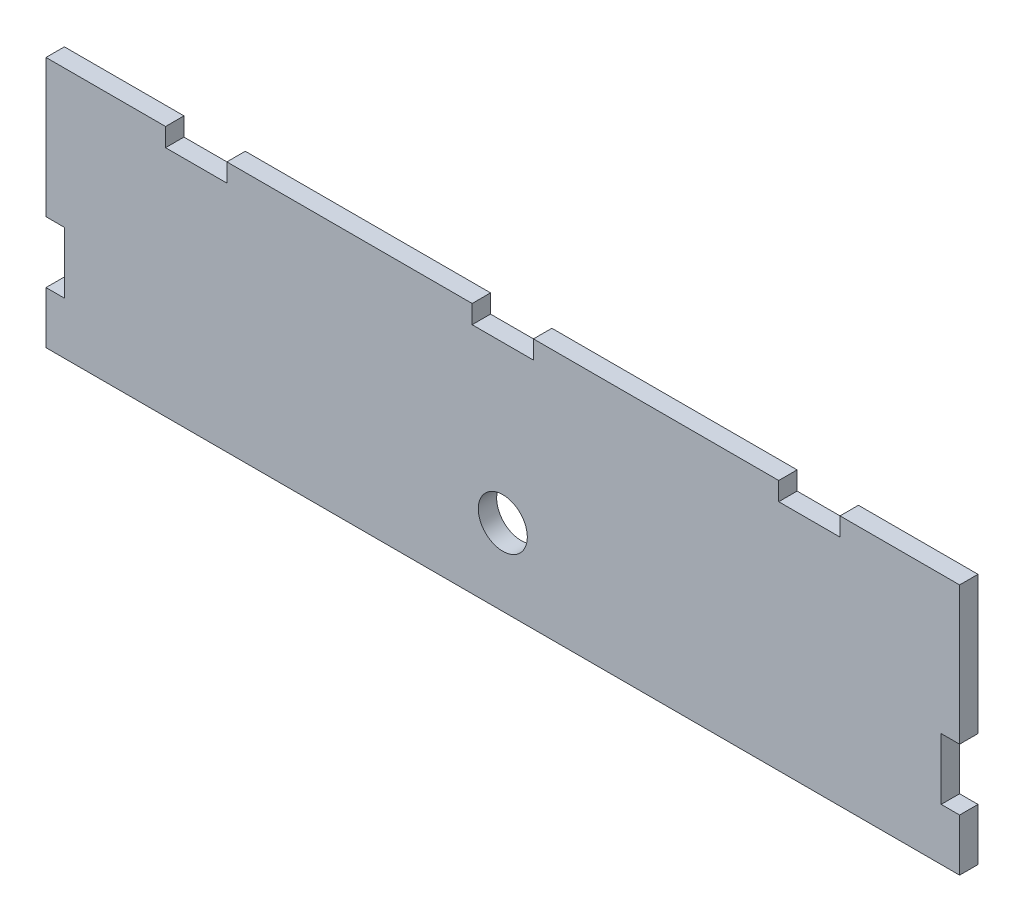
ISO-10303-21;
HEADER;
FILE_DESCRIPTION(('STEP AP214'),'2;1');
FILE_NAME('part.step','',(''),(''),'','','');
FILE_SCHEMA(('AUTOMOTIVE_DESIGN { 1 0 10303 214 1 1 1 1 }'));
ENDSEC;
DATA;
#1=APPLICATION_CONTEXT('core data for automotive mechanical design processes');
#2=APPLICATION_PROTOCOL_DEFINITION('international standard','automotive_design',2000,#1);
#3=PRODUCT_CONTEXT('',#1,'mechanical');
#4=PRODUCT('Part','Part','',(#3));
#5=PRODUCT_RELATED_PRODUCT_CATEGORY('part','',(#4));
#6=PRODUCT_DEFINITION_FORMATION('','',#4);
#7=PRODUCT_DEFINITION_CONTEXT('part definition',#1,'design');
#8=PRODUCT_DEFINITION('design','',#6,#7);
#9=PRODUCT_DEFINITION_SHAPE('','',#8);
#10=(LENGTH_UNIT() NAMED_UNIT(*) SI_UNIT(.MILLI.,.METRE.));
#11=(NAMED_UNIT(*) PLANE_ANGLE_UNIT() SI_UNIT($,.RADIAN.));
#12=(NAMED_UNIT(*) SI_UNIT($,.STERADIAN.) SOLID_ANGLE_UNIT());
#13=UNCERTAINTY_MEASURE_WITH_UNIT(LENGTH_MEASURE(1.E-05),#10,'distance_accuracy_value','');
#14=(GEOMETRIC_REPRESENTATION_CONTEXT(3) GLOBAL_UNCERTAINTY_ASSIGNED_CONTEXT((#13)) GLOBAL_UNIT_ASSIGNED_CONTEXT((#10,
#11,#12)) REPRESENTATION_CONTEXT('',''));
#15=CARTESIAN_POINT('',(0.,0.,0.));
#16=DIRECTION('',(0.,0.,1.));
#17=DIRECTION('',(1.,0.,0.));
#18=AXIS2_PLACEMENT_3D('',#15,#16,#17);
#19=CARTESIAN_POINT('',(74.5,-18.5,3.));
#20=DIRECTION('',(-1.,0.,0.));
#21=DIRECTION('',(0.,-1.,0.));
#22=AXIS2_PLACEMENT_3D('',#19,#20,#21);
#23=PLANE('',#22);
#24=DIRECTION('',(0.,1.,0.));
#25=VECTOR('',#24,1.);
#26=CARTESIAN_POINT('',(74.5,-18.5,0.));
#27=LINE('',#26,#25);
#28=CARTESIAN_POINT('',(74.5,-27.,0.));
#29=VERTEX_POINT('',#28);
#30=CARTESIAN_POINT('',(74.5,-18.5,0.));
#31=VERTEX_POINT('',#30);
#32=EDGE_CURVE('E224',#29,#31,#27,.T.);
#33=ORIENTED_EDGE('',*,*,#32,.T.);
#34=DIRECTION('',(0.,0.,-1.));
#35=VECTOR('',#34,1.);
#36=CARTESIAN_POINT('',(74.5,-18.5,3.));
#37=LINE('',#36,#35);
#38=CARTESIAN_POINT('',(74.5,-18.5,3.));
#39=VERTEX_POINT('',#38);
#40=EDGE_CURVE('E11',#39,#31,#37,.T.);
#41=ORIENTED_EDGE('',*,*,#40,.F.);
#42=DIRECTION('',(0.,1.,0.));
#43=VECTOR('',#42,1.);
#44=CARTESIAN_POINT('',(74.5,-18.5,3.));
#45=LINE('',#44,#43);
#46=CARTESIAN_POINT('',(74.5,-27.,3.));
#47=VERTEX_POINT('',#46);
#48=EDGE_CURVE('E271',#47,#39,#45,.T.);
#49=ORIENTED_EDGE('',*,*,#48,.F.);
#50=DIRECTION('',(0.,0.,-1.));
#51=VECTOR('',#50,1.);
#52=CARTESIAN_POINT('',(74.5,-27.,3.));
#53=LINE('',#52,#51);
#54=EDGE_CURVE('E220',#47,#29,#53,.T.);
#55=ORIENTED_EDGE('',*,*,#54,.T.);
#56=EDGE_LOOP('',(#33,#41,#49,#55));
#57=FACE_BOUND('',#56,.T.);
#58=ADVANCED_FACE('F32',(#57),#23,.F.);
#59=CARTESIAN_POINT('',(71.5,-18.5,3.));
#60=DIRECTION('',(0.,-1.,0.));
#61=DIRECTION('',(0.,0.,-1.));
#62=AXIS2_PLACEMENT_3D('',#59,#60,#61);
#63=PLANE('',#62);
#64=DIRECTION('',(-1.,0.,0.));
#65=VECTOR('',#64,1.);
#66=CARTESIAN_POINT('',(71.5,-18.5,0.));
#67=LINE('',#66,#65);
#68=CARTESIAN_POINT('',(71.5,-18.5,0.));
#69=VERTEX_POINT('',#68);
#70=EDGE_CURVE('E227',#31,#69,#67,.T.);
#71=ORIENTED_EDGE('',*,*,#70,.T.);
#72=DIRECTION('',(0.,0.,-1.));
#73=VECTOR('',#72,1.);
#74=CARTESIAN_POINT('',(71.5,-18.5,3.));
#75=LINE('',#74,#73);
#76=CARTESIAN_POINT('',(71.5,-18.5,3.));
#77=VERTEX_POINT('',#76);
#78=EDGE_CURVE('E40',#77,#69,#75,.T.);
#79=ORIENTED_EDGE('',*,*,#78,.F.);
#80=DIRECTION('',(-1.,0.,0.));
#81=VECTOR('',#80,1.);
#82=CARTESIAN_POINT('',(71.5,-18.5,3.));
#83=LINE('',#82,#81);
#84=EDGE_CURVE('E139',#39,#77,#83,.T.);
#85=ORIENTED_EDGE('',*,*,#84,.F.);
#86=ORIENTED_EDGE('',*,*,#40,.T.);
#87=EDGE_LOOP('',(#71,#79,#85,#86));
#88=FACE_BOUND('',#87,.T.);
#89=ADVANCED_FACE('F411',(#88),#63,.F.);
#90=CARTESIAN_POINT('',(71.5,-8.50000000000001,3.));
#91=DIRECTION('',(-1.,0.,0.));
#92=DIRECTION('',(0.,0.,1.));
#93=AXIS2_PLACEMENT_3D('',#90,#91,#92);
#94=PLANE('',#93);
#95=DIRECTION('',(0.,1.,0.));
#96=VECTOR('',#95,1.);
#97=CARTESIAN_POINT('',(71.5,-8.50000000000001,0.));
#98=LINE('',#97,#96);
#99=CARTESIAN_POINT('',(71.5,-8.50000000000001,0.));
#100=VERTEX_POINT('',#99);
#101=EDGE_CURVE('E230',#69,#100,#98,.T.);
#102=ORIENTED_EDGE('',*,*,#101,.T.);
#103=DIRECTION('',(0.,0.,-1.));
#104=VECTOR('',#103,1.);
#105=CARTESIAN_POINT('',(71.5,-8.50000000000001,3.));
#106=LINE('',#105,#104);
#107=CARTESIAN_POINT('',(71.5,-8.50000000000001,3.));
#108=VERTEX_POINT('',#107);
#109=EDGE_CURVE('E326',#108,#100,#106,.T.);
#110=ORIENTED_EDGE('',*,*,#109,.F.);
#111=DIRECTION('',(0.,1.,0.));
#112=VECTOR('',#111,1.);
#113=CARTESIAN_POINT('',(71.5,-8.50000000000001,3.));
#114=LINE('',#113,#112);
#115=EDGE_CURVE('E334',#77,#108,#114,.T.);
#116=ORIENTED_EDGE('',*,*,#115,.F.);
#117=ORIENTED_EDGE('',*,*,#78,.T.);
#118=EDGE_LOOP('',(#102,#110,#116,#117));
#119=FACE_BOUND('',#118,.T.);
#120=ADVANCED_FACE('F332',(#119),#94,.F.);
#121=CARTESIAN_POINT('',(71.5,-8.50000000000001,3.));
#122=DIRECTION('',(0.,1.,0.));
#123=DIRECTION('',(0.,0.,1.));
#124=AXIS2_PLACEMENT_3D('',#121,#122,#123);
#125=PLANE('',#124);
#126=DIRECTION('',(1.,0.,0.));
#127=VECTOR('',#126,1.);
#128=CARTESIAN_POINT('',(71.5,-8.50000000000001,0.));
#129=LINE('',#128,#127);
#130=CARTESIAN_POINT('',(74.5,-8.50000000000001,0.));
#131=VERTEX_POINT('',#130);
#132=EDGE_CURVE('E232',#100,#131,#129,.T.);
#133=ORIENTED_EDGE('',*,*,#132,.T.);
#134=DIRECTION('',(0.,0.,-1.));
#135=VECTOR('',#134,1.);
#136=CARTESIAN_POINT('',(74.5,-8.50000000000001,3.));
#137=LINE('',#136,#135);
#138=CARTESIAN_POINT('',(74.5,-8.50000000000001,3.));
#139=VERTEX_POINT('',#138);
#140=EDGE_CURVE('E323',#139,#131,#137,.T.);
#141=ORIENTED_EDGE('',*,*,#140,.F.);
#142=DIRECTION('',(1.,0.,0.));
#143=VECTOR('',#142,1.);
#144=CARTESIAN_POINT('',(71.5,-8.50000000000001,3.));
#145=LINE('',#144,#143);
#146=EDGE_CURVE('E352',#108,#139,#145,.T.);
#147=ORIENTED_EDGE('',*,*,#146,.F.);
#148=ORIENTED_EDGE('',*,*,#109,.T.);
#149=EDGE_LOOP('',(#133,#141,#147,#148));
#150=FACE_BOUND('',#149,.T.);
#151=ADVANCED_FACE('F343',(#150),#125,.F.);
#152=CARTESIAN_POINT('',(74.5,14.,3.));
#153=DIRECTION('',(-1.,0.,0.));
#154=DIRECTION('',(0.,0.,1.));
#155=AXIS2_PLACEMENT_3D('',#152,#153,#154);
#156=PLANE('',#155);
#157=DIRECTION('',(0.,1.,0.));
#158=VECTOR('',#157,1.);
#159=CARTESIAN_POINT('',(74.5,14.,0.));
#160=LINE('',#159,#158);
#161=CARTESIAN_POINT('',(74.5,14.,0.));
#162=VERTEX_POINT('',#161);
#163=EDGE_CURVE('E234',#131,#162,#160,.T.);
#164=ORIENTED_EDGE('',*,*,#163,.T.);
#165=DIRECTION('',(0.,0.,-1.));
#166=VECTOR('',#165,1.);
#167=CARTESIAN_POINT('',(74.5,14.,3.));
#168=LINE('',#167,#166);
#169=CARTESIAN_POINT('',(74.5,14.,3.));
#170=VERTEX_POINT('',#169);
#171=EDGE_CURVE('E320',#170,#162,#168,.T.);
#172=ORIENTED_EDGE('',*,*,#171,.F.);
#173=DIRECTION('',(0.,1.,0.));
#174=VECTOR('',#173,1.);
#175=CARTESIAN_POINT('',(74.5,14.,3.));
#176=LINE('',#175,#174);
#177=EDGE_CURVE('E349',#139,#170,#176,.T.);
#178=ORIENTED_EDGE('',*,*,#177,.F.);
#179=ORIENTED_EDGE('',*,*,#140,.T.);
#180=EDGE_LOOP('',(#164,#172,#178,#179));
#181=FACE_BOUND('',#180,.T.);
#182=ADVANCED_FACE('F347',(#181),#156,.F.);
#183=CARTESIAN_POINT('',(74.5,14.,3.));
#184=DIRECTION('',(0.,-1.,0.));
#185=DIRECTION('',(0.,0.,-1.));
#186=AXIS2_PLACEMENT_3D('',#183,#184,#185);
#187=PLANE('',#186);
#188=DIRECTION('',(-1.,0.,0.));
#189=VECTOR('',#188,1.);
#190=CARTESIAN_POINT('',(74.5,14.,0.));
#191=LINE('',#190,#189);
#192=CARTESIAN_POINT('',(55.,14.,0.));
#193=VERTEX_POINT('',#192);
#194=EDGE_CURVE('E236',#162,#193,#191,.T.);
#195=ORIENTED_EDGE('',*,*,#194,.T.);
#196=DIRECTION('',(0.,0.,-1.));
#197=VECTOR('',#196,1.);
#198=CARTESIAN_POINT('',(55.,14.,3.));
#199=LINE('',#198,#197);
#200=CARTESIAN_POINT('',(55.,14.,3.));
#201=VERTEX_POINT('',#200);
#202=EDGE_CURVE('E317',#201,#193,#199,.T.);
#203=ORIENTED_EDGE('',*,*,#202,.F.);
#204=DIRECTION('',(-1.,0.,0.));
#205=VECTOR('',#204,1.);
#206=CARTESIAN_POINT('',(74.5,14.,3.));
#207=LINE('',#206,#205);
#208=EDGE_CURVE('E351',#170,#201,#207,.T.);
#209=ORIENTED_EDGE('',*,*,#208,.F.);
#210=ORIENTED_EDGE('',*,*,#171,.T.);
#211=EDGE_LOOP('',(#195,#203,#209,#210));
#212=FACE_BOUND('',#211,.T.);
#213=ADVANCED_FACE('F424',(#212),#187,.F.);
#214=CARTESIAN_POINT('',(55.,14.,3.));
#215=DIRECTION('',(1.,0.,0.));
#216=DIRECTION('',(0.,0.,-1.));
#217=AXIS2_PLACEMENT_3D('',#214,#215,#216);
#218=PLANE('',#217);
#219=DIRECTION('',(0.,-1.,0.));
#220=VECTOR('',#219,1.);
#221=CARTESIAN_POINT('',(55.,14.,0.));
#222=LINE('',#221,#220);
#223=CARTESIAN_POINT('',(55.,11.,0.));
#224=VERTEX_POINT('',#223);
#225=EDGE_CURVE('E238',#193,#224,#222,.T.);
#226=ORIENTED_EDGE('',*,*,#225,.T.);
#227=DIRECTION('',(0.,0.,-1.));
#228=VECTOR('',#227,1.);
#229=CARTESIAN_POINT('',(55.,11.,3.));
#230=LINE('',#229,#228);
#231=CARTESIAN_POINT('',(55.,11.,3.));
#232=VERTEX_POINT('',#231);
#233=EDGE_CURVE('E314',#232,#224,#230,.T.);
#234=ORIENTED_EDGE('',*,*,#233,.F.);
#235=DIRECTION('',(0.,-1.,0.));
#236=VECTOR('',#235,1.);
#237=CARTESIAN_POINT('',(55.,14.,3.));
#238=LINE('',#237,#236);
#239=EDGE_CURVE('E354',#201,#232,#238,.T.);
#240=ORIENTED_EDGE('',*,*,#239,.F.);
#241=ORIENTED_EDGE('',*,*,#202,.T.);
#242=EDGE_LOOP('',(#226,#234,#240,#241));
#243=FACE_BOUND('',#242,.T.);
#244=ADVANCED_FACE('F427',(#243),#218,.F.);
#245=CARTESIAN_POINT('',(45.,11.,3.));
#246=DIRECTION('',(0.,-1.,0.));
#247=DIRECTION('',(0.,0.,-1.));
#248=AXIS2_PLACEMENT_3D('',#245,#246,#247);
#249=PLANE('',#248);
#250=DIRECTION('',(-1.,0.,0.));
#251=VECTOR('',#250,1.);
#252=CARTESIAN_POINT('',(45.,11.,0.));
#253=LINE('',#252,#251);
#254=CARTESIAN_POINT('',(45.,11.,0.));
#255=VERTEX_POINT('',#254);
#256=EDGE_CURVE('E240',#224,#255,#253,.T.);
#257=ORIENTED_EDGE('',*,*,#256,.T.);
#258=DIRECTION('',(0.,0.,-1.));
#259=VECTOR('',#258,1.);
#260=CARTESIAN_POINT('',(45.,11.,3.));
#261=LINE('',#260,#259);
#262=CARTESIAN_POINT('',(45.,11.,3.));
#263=VERTEX_POINT('',#262);
#264=EDGE_CURVE('E311',#263,#255,#261,.T.);
#265=ORIENTED_EDGE('',*,*,#264,.F.);
#266=DIRECTION('',(-1.,0.,0.));
#267=VECTOR('',#266,1.);
#268=CARTESIAN_POINT('',(45.,11.,3.));
#269=LINE('',#268,#267);
#270=EDGE_CURVE('E360',#232,#263,#269,.T.);
#271=ORIENTED_EDGE('',*,*,#270,.F.);
#272=ORIENTED_EDGE('',*,*,#233,.T.);
#273=EDGE_LOOP('',(#257,#265,#271,#272));
#274=FACE_BOUND('',#273,.T.);
#275=ADVANCED_FACE('F431',(#274),#249,.F.);
#276=CARTESIAN_POINT('',(45.,14.,3.));
#277=DIRECTION('',(-1.,0.,0.));
#278=DIRECTION('',(0.,0.,1.));
#279=AXIS2_PLACEMENT_3D('',#276,#277,#278);
#280=PLANE('',#279);
#281=DIRECTION('',(0.,1.,0.));
#282=VECTOR('',#281,1.);
#283=CARTESIAN_POINT('',(45.,14.,0.));
#284=LINE('',#283,#282);
#285=CARTESIAN_POINT('',(45.,14.,0.));
#286=VERTEX_POINT('',#285);
#287=EDGE_CURVE('E242',#255,#286,#284,.T.);
#288=ORIENTED_EDGE('',*,*,#287,.T.);
#289=DIRECTION('',(0.,0.,-1.));
#290=VECTOR('',#289,1.);
#291=CARTESIAN_POINT('',(45.,14.,3.));
#292=LINE('',#291,#290);
#293=CARTESIAN_POINT('',(45.,14.,3.));
#294=VERTEX_POINT('',#293);
#295=EDGE_CURVE('E308',#294,#286,#292,.T.);
#296=ORIENTED_EDGE('',*,*,#295,.F.);
#297=DIRECTION('',(0.,1.,0.));
#298=VECTOR('',#297,1.);
#299=CARTESIAN_POINT('',(45.,14.,3.));
#300=LINE('',#299,#298);
#301=EDGE_CURVE('E362',#263,#294,#300,.T.);
#302=ORIENTED_EDGE('',*,*,#301,.F.);
#303=ORIENTED_EDGE('',*,*,#264,.T.);
#304=EDGE_LOOP('',(#288,#296,#302,#303));
#305=FACE_BOUND('',#304,.T.);
#306=ADVANCED_FACE('F435',(#305),#280,.F.);
#307=CARTESIAN_POINT('',(45.,14.,3.));
#308=DIRECTION('',(0.,-1.,0.));
#309=DIRECTION('',(1.,0.,0.));
#310=AXIS2_PLACEMENT_3D('',#307,#308,#309);
#311=PLANE('',#310);
#312=DIRECTION('',(-1.,0.,0.));
#313=VECTOR('',#312,1.);
#314=CARTESIAN_POINT('',(45.,14.,0.));
#315=LINE('',#314,#313);
#316=CARTESIAN_POINT('',(5.,14.,0.));
#317=VERTEX_POINT('',#316);
#318=EDGE_CURVE('E244',#286,#317,#315,.T.);
#319=ORIENTED_EDGE('',*,*,#318,.T.);
#320=DIRECTION('',(0.,0.,-1.));
#321=VECTOR('',#320,1.);
#322=CARTESIAN_POINT('',(5.,14.,3.));
#323=LINE('',#322,#321);
#324=CARTESIAN_POINT('',(5.,14.,3.));
#325=VERTEX_POINT('',#324);
#326=EDGE_CURVE('E305',#325,#317,#323,.T.);
#327=ORIENTED_EDGE('',*,*,#326,.F.);
#328=DIRECTION('',(-1.,0.,0.));
#329=VECTOR('',#328,1.);
#330=CARTESIAN_POINT('',(45.,14.,3.));
#331=LINE('',#330,#329);
#332=EDGE_CURVE('E364',#294,#325,#331,.T.);
#333=ORIENTED_EDGE('',*,*,#332,.F.);
#334=ORIENTED_EDGE('',*,*,#295,.T.);
#335=EDGE_LOOP('',(#319,#327,#333,#334));
#336=FACE_BOUND('',#335,.T.);
#337=ADVANCED_FACE('F439',(#336),#311,.F.);
#338=CARTESIAN_POINT('',(5.,14.,3.));
#339=DIRECTION('',(1.,0.,0.));
#340=DIRECTION('',(0.,0.,-1.));
#341=AXIS2_PLACEMENT_3D('',#338,#339,#340);
#342=PLANE('',#341);
#343=DIRECTION('',(0.,-1.,0.));
#344=VECTOR('',#343,1.);
#345=CARTESIAN_POINT('',(5.,14.,0.));
#346=LINE('',#345,#344);
#347=CARTESIAN_POINT('',(5.,11.,0.));
#348=VERTEX_POINT('',#347);
#349=EDGE_CURVE('E246',#317,#348,#346,.T.);
#350=ORIENTED_EDGE('',*,*,#349,.T.);
#351=DIRECTION('',(0.,0.,-1.));
#352=VECTOR('',#351,1.);
#353=CARTESIAN_POINT('',(5.,11.,3.));
#354=LINE('',#353,#352);
#355=CARTESIAN_POINT('',(5.,11.,3.));
#356=VERTEX_POINT('',#355);
#357=EDGE_CURVE('E302',#356,#348,#354,.T.);
#358=ORIENTED_EDGE('',*,*,#357,.F.);
#359=DIRECTION('',(0.,-1.,0.));
#360=VECTOR('',#359,1.);
#361=CARTESIAN_POINT('',(5.,14.,3.));
#362=LINE('',#361,#360);
#363=EDGE_CURVE('E366',#325,#356,#362,.T.);
#364=ORIENTED_EDGE('',*,*,#363,.F.);
#365=ORIENTED_EDGE('',*,*,#326,.T.);
#366=EDGE_LOOP('',(#350,#358,#364,#365));
#367=FACE_BOUND('',#366,.T.);
#368=ADVANCED_FACE('F443',(#367),#342,.F.);
#369=CARTESIAN_POINT('',(-5.,11.,3.));
#370=DIRECTION('',(0.,-1.,0.));
#371=DIRECTION('',(0.,0.,-1.));
#372=AXIS2_PLACEMENT_3D('',#369,#370,#371);
#373=PLANE('',#372);
#374=DIRECTION('',(-1.,0.,0.));
#375=VECTOR('',#374,1.);
#376=CARTESIAN_POINT('',(-5.,11.,0.));
#377=LINE('',#376,#375);
#378=CARTESIAN_POINT('',(-5.,11.,0.));
#379=VERTEX_POINT('',#378);
#380=EDGE_CURVE('E248',#348,#379,#377,.T.);
#381=ORIENTED_EDGE('',*,*,#380,.T.);
#382=DIRECTION('',(0.,0.,-1.));
#383=VECTOR('',#382,1.);
#384=CARTESIAN_POINT('',(-5.,11.,3.));
#385=LINE('',#384,#383);
#386=CARTESIAN_POINT('',(-5.,11.,3.));
#387=VERTEX_POINT('',#386);
#388=EDGE_CURVE('E299',#387,#379,#385,.T.);
#389=ORIENTED_EDGE('',*,*,#388,.F.);
#390=DIRECTION('',(-1.,0.,0.));
#391=VECTOR('',#390,1.);
#392=CARTESIAN_POINT('',(-5.,11.,3.));
#393=LINE('',#392,#391);
#394=EDGE_CURVE('E368',#356,#387,#393,.T.);
#395=ORIENTED_EDGE('',*,*,#394,.F.);
#396=ORIENTED_EDGE('',*,*,#357,.T.);
#397=EDGE_LOOP('',(#381,#389,#395,#396));
#398=FACE_BOUND('',#397,.T.);
#399=ADVANCED_FACE('F447',(#398),#373,.F.);
#400=CARTESIAN_POINT('',(-5.,14.,3.));
#401=DIRECTION('',(-1.,0.,0.));
#402=DIRECTION('',(0.,0.,1.));
#403=AXIS2_PLACEMENT_3D('',#400,#401,#402);
#404=PLANE('',#403);
#405=DIRECTION('',(0.,1.,0.));
#406=VECTOR('',#405,1.);
#407=CARTESIAN_POINT('',(-5.,14.,0.));
#408=LINE('',#407,#406);
#409=CARTESIAN_POINT('',(-5.,14.,0.));
#410=VERTEX_POINT('',#409);
#411=EDGE_CURVE('E250',#379,#410,#408,.T.);
#412=ORIENTED_EDGE('',*,*,#411,.T.);
#413=DIRECTION('',(0.,0.,-1.));
#414=VECTOR('',#413,1.);
#415=CARTESIAN_POINT('',(-5.,14.,3.));
#416=LINE('',#415,#414);
#417=CARTESIAN_POINT('',(-5.,14.,3.));
#418=VERTEX_POINT('',#417);
#419=EDGE_CURVE('E296',#418,#410,#416,.T.);
#420=ORIENTED_EDGE('',*,*,#419,.F.);
#421=DIRECTION('',(0.,1.,0.));
#422=VECTOR('',#421,1.);
#423=CARTESIAN_POINT('',(-5.,14.,3.));
#424=LINE('',#423,#422);
#425=EDGE_CURVE('E370',#387,#418,#424,.T.);
#426=ORIENTED_EDGE('',*,*,#425,.F.);
#427=ORIENTED_EDGE('',*,*,#388,.T.);
#428=EDGE_LOOP('',(#412,#420,#426,#427));
#429=FACE_BOUND('',#428,.T.);
#430=ADVANCED_FACE('F451',(#429),#404,.F.);
#431=CARTESIAN_POINT('',(-5.,14.,3.));
#432=DIRECTION('',(0.,-1.,0.));
#433=DIRECTION('',(1.,0.,0.));
#434=AXIS2_PLACEMENT_3D('',#431,#432,#433);
#435=PLANE('',#434);
#436=DIRECTION('',(-1.,0.,0.));
#437=VECTOR('',#436,1.);
#438=CARTESIAN_POINT('',(-5.,14.,0.));
#439=LINE('',#438,#437);
#440=CARTESIAN_POINT('',(-45.,14.,0.));
#441=VERTEX_POINT('',#440);
#442=EDGE_CURVE('E252',#410,#441,#439,.T.);
#443=ORIENTED_EDGE('',*,*,#442,.T.);
#444=DIRECTION('',(0.,0.,-1.));
#445=VECTOR('',#444,1.);
#446=CARTESIAN_POINT('',(-45.,14.,3.));
#447=LINE('',#446,#445);
#448=CARTESIAN_POINT('',(-45.,14.,3.));
#449=VERTEX_POINT('',#448);
#450=EDGE_CURVE('E293',#449,#441,#447,.T.);
#451=ORIENTED_EDGE('',*,*,#450,.F.);
#452=DIRECTION('',(-1.,0.,0.));
#453=VECTOR('',#452,1.);
#454=CARTESIAN_POINT('',(-5.,14.,3.));
#455=LINE('',#454,#453);
#456=EDGE_CURVE('E372',#418,#449,#455,.T.);
#457=ORIENTED_EDGE('',*,*,#456,.F.);
#458=ORIENTED_EDGE('',*,*,#419,.T.);
#459=EDGE_LOOP('',(#443,#451,#457,#458));
#460=FACE_BOUND('',#459,.T.);
#461=ADVANCED_FACE('F455',(#460),#435,.F.);
#462=CARTESIAN_POINT('',(-45.,14.,3.));
#463=DIRECTION('',(1.,0.,0.));
#464=DIRECTION('',(0.,0.,-1.));
#465=AXIS2_PLACEMENT_3D('',#462,#463,#464);
#466=PLANE('',#465);
#467=DIRECTION('',(0.,-1.,0.));
#468=VECTOR('',#467,1.);
#469=CARTESIAN_POINT('',(-45.,14.,0.));
#470=LINE('',#469,#468);
#471=CARTESIAN_POINT('',(-45.,11.,0.));
#472=VERTEX_POINT('',#471);
#473=EDGE_CURVE('E254',#441,#472,#470,.T.);
#474=ORIENTED_EDGE('',*,*,#473,.T.);
#475=DIRECTION('',(0.,0.,-1.));
#476=VECTOR('',#475,1.);
#477=CARTESIAN_POINT('',(-45.,11.,3.));
#478=LINE('',#477,#476);
#479=CARTESIAN_POINT('',(-45.,11.,3.));
#480=VERTEX_POINT('',#479);
#481=EDGE_CURVE('E290',#480,#472,#478,.T.);
#482=ORIENTED_EDGE('',*,*,#481,.F.);
#483=DIRECTION('',(0.,-1.,0.));
#484=VECTOR('',#483,1.);
#485=CARTESIAN_POINT('',(-45.,14.,3.));
#486=LINE('',#485,#484);
#487=EDGE_CURVE('E374',#449,#480,#486,.T.);
#488=ORIENTED_EDGE('',*,*,#487,.F.);
#489=ORIENTED_EDGE('',*,*,#450,.T.);
#490=EDGE_LOOP('',(#474,#482,#488,#489));
#491=FACE_BOUND('',#490,.T.);
#492=ADVANCED_FACE('F459',(#491),#466,.F.);
#493=CARTESIAN_POINT('',(-45.,11.,3.));
#494=DIRECTION('',(0.,-1.,0.));
#495=DIRECTION('',(1.,0.,0.));
#496=AXIS2_PLACEMENT_3D('',#493,#494,#495);
#497=PLANE('',#496);
#498=DIRECTION('',(-1.,0.,0.));
#499=VECTOR('',#498,1.);
#500=CARTESIAN_POINT('',(-45.,11.,0.));
#501=LINE('',#500,#499);
#502=CARTESIAN_POINT('',(-55.,11.,0.));
#503=VERTEX_POINT('',#502);
#504=EDGE_CURVE('E256',#472,#503,#501,.T.);
#505=ORIENTED_EDGE('',*,*,#504,.T.);
#506=DIRECTION('',(0.,0.,-1.));
#507=VECTOR('',#506,1.);
#508=CARTESIAN_POINT('',(-55.,11.,3.));
#509=LINE('',#508,#507);
#510=CARTESIAN_POINT('',(-55.,11.,3.));
#511=VERTEX_POINT('',#510);
#512=EDGE_CURVE('E287',#511,#503,#509,.T.);
#513=ORIENTED_EDGE('',*,*,#512,.F.);
#514=DIRECTION('',(-1.,0.,0.));
#515=VECTOR('',#514,1.);
#516=CARTESIAN_POINT('',(-45.,11.,3.));
#517=LINE('',#516,#515);
#518=EDGE_CURVE('E376',#480,#511,#517,.T.);
#519=ORIENTED_EDGE('',*,*,#518,.F.);
#520=ORIENTED_EDGE('',*,*,#481,.T.);
#521=EDGE_LOOP('',(#505,#513,#519,#520));
#522=FACE_BOUND('',#521,.T.);
#523=ADVANCED_FACE('F463',(#522),#497,.F.);
#524=CARTESIAN_POINT('',(-55.,14.,3.));
#525=DIRECTION('',(-1.,0.,0.));
#526=DIRECTION('',(0.,0.,1.));
#527=AXIS2_PLACEMENT_3D('',#524,#525,#526);
#528=PLANE('',#527);
#529=DIRECTION('',(0.,1.,0.));
#530=VECTOR('',#529,1.);
#531=CARTESIAN_POINT('',(-55.,14.,0.));
#532=LINE('',#531,#530);
#533=CARTESIAN_POINT('',(-55.,14.,0.));
#534=VERTEX_POINT('',#533);
#535=EDGE_CURVE('E258',#503,#534,#532,.T.);
#536=ORIENTED_EDGE('',*,*,#535,.T.);
#537=DIRECTION('',(0.,0.,-1.));
#538=VECTOR('',#537,1.);
#539=CARTESIAN_POINT('',(-55.,14.,3.));
#540=LINE('',#539,#538);
#541=CARTESIAN_POINT('',(-55.,14.,3.));
#542=VERTEX_POINT('',#541);
#543=EDGE_CURVE('E284',#542,#534,#540,.T.);
#544=ORIENTED_EDGE('',*,*,#543,.F.);
#545=DIRECTION('',(0.,1.,0.));
#546=VECTOR('',#545,1.);
#547=CARTESIAN_POINT('',(-55.,14.,3.));
#548=LINE('',#547,#546);
#549=EDGE_CURVE('E378',#511,#542,#548,.T.);
#550=ORIENTED_EDGE('',*,*,#549,.F.);
#551=ORIENTED_EDGE('',*,*,#512,.T.);
#552=EDGE_LOOP('',(#536,#544,#550,#551));
#553=FACE_BOUND('',#552,.T.);
#554=ADVANCED_FACE('F467',(#553),#528,.F.);
#555=CARTESIAN_POINT('',(-55.,14.,3.));
#556=DIRECTION('',(0.,-1.,0.));
#557=DIRECTION('',(0.,0.,-1.));
#558=AXIS2_PLACEMENT_3D('',#555,#556,#557);
#559=PLANE('',#558);
#560=DIRECTION('',(-1.,0.,0.));
#561=VECTOR('',#560,1.);
#562=CARTESIAN_POINT('',(-55.,14.,0.));
#563=LINE('',#562,#561);
#564=CARTESIAN_POINT('',(-74.5,14.,0.));
#565=VERTEX_POINT('',#564);
#566=EDGE_CURVE('E260',#534,#565,#563,.T.);
#567=ORIENTED_EDGE('',*,*,#566,.T.);
#568=DIRECTION('',(0.,0.,-1.));
#569=VECTOR('',#568,1.);
#570=CARTESIAN_POINT('',(-74.5,14.,3.));
#571=LINE('',#570,#569);
#572=CARTESIAN_POINT('',(-74.5,14.,3.));
#573=VERTEX_POINT('',#572);
#574=EDGE_CURVE('E281',#573,#565,#571,.T.);
#575=ORIENTED_EDGE('',*,*,#574,.F.);
#576=DIRECTION('',(-1.,0.,0.));
#577=VECTOR('',#576,1.);
#578=CARTESIAN_POINT('',(-55.,14.,3.));
#579=LINE('',#578,#577);
#580=EDGE_CURVE('E380',#542,#573,#579,.T.);
#581=ORIENTED_EDGE('',*,*,#580,.F.);
#582=ORIENTED_EDGE('',*,*,#543,.T.);
#583=EDGE_LOOP('',(#567,#575,#581,#582));
#584=FACE_BOUND('',#583,.T.);
#585=ADVANCED_FACE('F471',(#584),#559,.F.);
#586=CARTESIAN_POINT('',(-74.5,14.,3.));
#587=DIRECTION('',(1.,0.,0.));
#588=DIRECTION('',(0.,0.,-1.));
#589=AXIS2_PLACEMENT_3D('',#586,#587,#588);
#590=PLANE('',#589);
#591=DIRECTION('',(0.,-1.,0.));
#592=VECTOR('',#591,1.);
#593=CARTESIAN_POINT('',(-74.5,14.,0.));
#594=LINE('',#593,#592);
#595=CARTESIAN_POINT('',(-74.5,-8.50000000000001,0.));
#596=VERTEX_POINT('',#595);
#597=EDGE_CURVE('E262',#565,#596,#594,.T.);
#598=ORIENTED_EDGE('',*,*,#597,.T.);
#599=DIRECTION('',(0.,0.,-1.));
#600=VECTOR('',#599,1.);
#601=CARTESIAN_POINT('',(-74.5,-8.50000000000001,3.));
#602=LINE('',#601,#600);
#603=CARTESIAN_POINT('',(-74.5,-8.50000000000001,3.));
#604=VERTEX_POINT('',#603);
#605=EDGE_CURVE('E278',#604,#596,#602,.T.);
#606=ORIENTED_EDGE('',*,*,#605,.F.);
#607=DIRECTION('',(0.,-1.,0.));
#608=VECTOR('',#607,1.);
#609=CARTESIAN_POINT('',(-74.5,14.,3.));
#610=LINE('',#609,#608);
#611=EDGE_CURVE('E382',#573,#604,#610,.T.);
#612=ORIENTED_EDGE('',*,*,#611,.F.);
#613=ORIENTED_EDGE('',*,*,#574,.T.);
#614=EDGE_LOOP('',(#598,#606,#612,#613));
#615=FACE_BOUND('',#614,.T.);
#616=ADVANCED_FACE('F475',(#615),#590,.F.);
#617=CARTESIAN_POINT('',(-71.5,-8.50000000000001,3.));
#618=DIRECTION('',(0.,1.,0.));
#619=DIRECTION('',(0.,0.,1.));
#620=AXIS2_PLACEMENT_3D('',#617,#618,#619);
#621=PLANE('',#620);
#622=DIRECTION('',(1.,0.,0.));
#623=VECTOR('',#622,1.);
#624=CARTESIAN_POINT('',(-71.5,-8.50000000000001,0.));
#625=LINE('',#624,#623);
#626=CARTESIAN_POINT('',(-71.5,-8.50000000000001,0.));
#627=VERTEX_POINT('',#626);
#628=EDGE_CURVE('E264',#596,#627,#625,.T.);
#629=ORIENTED_EDGE('',*,*,#628,.T.);
#630=DIRECTION('',(0.,0.,-1.));
#631=VECTOR('',#630,1.);
#632=CARTESIAN_POINT('',(-71.5,-8.50000000000001,3.));
#633=LINE('',#632,#631);
#634=CARTESIAN_POINT('',(-71.5,-8.50000000000001,3.));
#635=VERTEX_POINT('',#634);
#636=EDGE_CURVE('E275',#635,#627,#633,.T.);
#637=ORIENTED_EDGE('',*,*,#636,.F.);
#638=DIRECTION('',(1.,0.,0.));
#639=VECTOR('',#638,1.);
#640=CARTESIAN_POINT('',(-71.5,-8.50000000000001,3.));
#641=LINE('',#640,#639);
#642=EDGE_CURVE('E384',#604,#635,#641,.T.);
#643=ORIENTED_EDGE('',*,*,#642,.F.);
#644=ORIENTED_EDGE('',*,*,#605,.T.);
#645=EDGE_LOOP('',(#629,#637,#643,#644));
#646=FACE_BOUND('',#645,.T.);
#647=ADVANCED_FACE('F390',(#646),#621,.F.);
#648=CARTESIAN_POINT('',(-71.5,-8.50000000000001,3.));
#649=DIRECTION('',(1.,0.,0.));
#650=DIRECTION('',(0.,0.,-1.));
#651=AXIS2_PLACEMENT_3D('',#648,#649,#650);
#652=PLANE('',#651);
#653=DIRECTION('',(0.,-1.,0.));
#654=VECTOR('',#653,1.);
#655=CARTESIAN_POINT('',(-71.5,-8.50000000000001,0.));
#656=LINE('',#655,#654);
#657=CARTESIAN_POINT('',(-71.5,-18.5,0.));
#658=VERTEX_POINT('',#657);
#659=EDGE_CURVE('E266',#627,#658,#656,.T.);
#660=ORIENTED_EDGE('',*,*,#659,.T.);
#661=DIRECTION('',(0.,0.,-1.));
#662=VECTOR('',#661,1.);
#663=CARTESIAN_POINT('',(-71.5,-18.5,3.));
#664=LINE('',#663,#662);
#665=CARTESIAN_POINT('',(-71.5,-18.5,3.));
#666=VERTEX_POINT('',#665);
#667=EDGE_CURVE('E215',#666,#658,#664,.T.);
#668=ORIENTED_EDGE('',*,*,#667,.F.);
#669=DIRECTION('',(0.,-1.,0.));
#670=VECTOR('',#669,1.);
#671=CARTESIAN_POINT('',(-71.5,-8.50000000000001,3.));
#672=LINE('',#671,#670);
#673=EDGE_CURVE('E206',#635,#666,#672,.T.);
#674=ORIENTED_EDGE('',*,*,#673,.F.);
#675=ORIENTED_EDGE('',*,*,#636,.T.);
#676=EDGE_LOOP('',(#660,#668,#674,#675));
#677=FACE_BOUND('',#676,.T.);
#678=ADVANCED_FACE('F394',(#677),#652,.F.);
#679=CARTESIAN_POINT('',(-71.5,-18.5,3.));
#680=DIRECTION('',(0.,-1.,0.));
#681=DIRECTION('',(0.,0.,-1.));
#682=AXIS2_PLACEMENT_3D('',#679,#680,#681);
#683=PLANE('',#682);
#684=DIRECTION('',(-1.,0.,0.));
#685=VECTOR('',#684,1.);
#686=CARTESIAN_POINT('',(-71.5,-18.5,0.));
#687=LINE('',#686,#685);
#688=CARTESIAN_POINT('',(-74.5,-18.5,0.));
#689=VERTEX_POINT('',#688);
#690=EDGE_CURVE('E214',#658,#689,#687,.T.);
#691=ORIENTED_EDGE('',*,*,#690,.T.);
#692=DIRECTION('',(0.,0.,-1.));
#693=VECTOR('',#692,1.);
#694=CARTESIAN_POINT('',(-74.5,-18.5,3.));
#695=LINE('',#694,#693);
#696=CARTESIAN_POINT('',(-74.5,-18.5,3.));
#697=VERTEX_POINT('',#696);
#698=EDGE_CURVE('E211',#697,#689,#695,.T.);
#699=ORIENTED_EDGE('',*,*,#698,.F.);
#700=DIRECTION('',(-1.,0.,0.));
#701=VECTOR('',#700,1.);
#702=CARTESIAN_POINT('',(-71.5,-18.5,3.));
#703=LINE('',#702,#701);
#704=EDGE_CURVE('E200',#666,#697,#703,.T.);
#705=ORIENTED_EDGE('',*,*,#704,.F.);
#706=ORIENTED_EDGE('',*,*,#667,.T.);
#707=EDGE_LOOP('',(#691,#699,#705,#706));
#708=FACE_BOUND('',#707,.T.);
#709=ADVANCED_FACE('F212',(#708),#683,.F.);
#710=CARTESIAN_POINT('',(-74.5,-18.5,3.));
#711=DIRECTION('',(1.,0.,0.));
#712=DIRECTION('',(0.,0.,-1.));
#713=AXIS2_PLACEMENT_3D('',#710,#711,#712);
#714=PLANE('',#713);
#715=DIRECTION('',(0.,-1.,0.));
#716=VECTOR('',#715,1.);
#717=CARTESIAN_POINT('',(-74.5,-18.5,0.));
#718=LINE('',#717,#716);
#719=CARTESIAN_POINT('',(-74.5,-27.,0.));
#720=VERTEX_POINT('',#719);
#721=EDGE_CURVE('E125',#689,#720,#718,.T.);
#722=ORIENTED_EDGE('',*,*,#721,.T.);
#723=DIRECTION('',(0.,0.,-1.));
#724=VECTOR('',#723,1.);
#725=CARTESIAN_POINT('',(-74.5,-27.,3.));
#726=LINE('',#725,#724);
#727=CARTESIAN_POINT('',(-74.5,-27.,3.));
#728=VERTEX_POINT('',#727);
#729=EDGE_CURVE('E216',#728,#720,#726,.T.);
#730=ORIENTED_EDGE('',*,*,#729,.F.);
#731=DIRECTION('',(0.,-1.,0.));
#732=VECTOR('',#731,1.);
#733=CARTESIAN_POINT('',(-74.5,-18.5,3.));
#734=LINE('',#733,#732);
#735=EDGE_CURVE('E204',#697,#728,#734,.T.);
#736=ORIENTED_EDGE('',*,*,#735,.F.);
#737=ORIENTED_EDGE('',*,*,#698,.T.);
#738=EDGE_LOOP('',(#722,#730,#736,#737));
#739=FACE_BOUND('',#738,.T.);
#740=ADVANCED_FACE('F218',(#739),#714,.F.);
#741=CARTESIAN_POINT('',(-74.5,-27.,3.));
#742=DIRECTION('',(0.,1.,0.));
#743=DIRECTION('',(0.,0.,1.));
#744=AXIS2_PLACEMENT_3D('',#741,#742,#743);
#745=PLANE('',#744);
#746=DIRECTION('',(1.,0.,0.));
#747=VECTOR('',#746,1.);
#748=CARTESIAN_POINT('',(-74.5,-27.,0.));
#749=LINE('',#748,#747);
#750=EDGE_CURVE('E131',#720,#29,#749,.T.);
#751=ORIENTED_EDGE('',*,*,#750,.T.);
#752=ORIENTED_EDGE('',*,*,#54,.F.);
#753=DIRECTION('',(1.,0.,0.));
#754=VECTOR('',#753,1.);
#755=CARTESIAN_POINT('',(-74.5,-27.,3.));
#756=LINE('',#755,#754);
#757=EDGE_CURVE('E48',#728,#47,#756,.T.);
#758=ORIENTED_EDGE('',*,*,#757,.F.);
#759=ORIENTED_EDGE('',*,*,#729,.T.);
#760=EDGE_LOOP('',(#751,#752,#758,#759));
#761=FACE_BOUND('',#760,.T.);
#762=ADVANCED_FACE('F398',(#761),#745,.F.);
#763=CARTESIAN_POINT('',(0.,0.,3.));
#764=DIRECTION('',(0.,0.,1.));
#765=DIRECTION('',(1.,0.,0.));
#766=AXIS2_PLACEMENT_3D('',#763,#764,#765);
#767=PLANE('',#766);
#768=CARTESIAN_POINT('',(0.,-14.5,3.));
#769=DIRECTION('',(0.,0.,1.));
#770=DIRECTION('',(1.,0.,0.));
#771=AXIS2_PLACEMENT_3D('',#768,#769,#770);
#772=CIRCLE('',#771,4.);
#773=CARTESIAN_POINT('',(4.,-14.5,3.));
#774=VERTEX_POINT('',#773);
#775=EDGE_CURVE('E228',#774,#774,#772,.T.);
#776=ORIENTED_EDGE('',*,*,#775,.F.);
#777=EDGE_LOOP('',(#776));
#778=FACE_BOUND('',#777,.T.);
#779=ORIENTED_EDGE('',*,*,#48,.T.);
#780=ORIENTED_EDGE('',*,*,#84,.T.);
#781=ORIENTED_EDGE('',*,*,#115,.T.);
#782=ORIENTED_EDGE('',*,*,#146,.T.);
#783=ORIENTED_EDGE('',*,*,#177,.T.);
#784=ORIENTED_EDGE('',*,*,#208,.T.);
#785=ORIENTED_EDGE('',*,*,#239,.T.);
#786=ORIENTED_EDGE('',*,*,#270,.T.);
#787=ORIENTED_EDGE('',*,*,#301,.T.);
#788=ORIENTED_EDGE('',*,*,#332,.T.);
#789=ORIENTED_EDGE('',*,*,#363,.T.);
#790=ORIENTED_EDGE('',*,*,#394,.T.);
#791=ORIENTED_EDGE('',*,*,#425,.T.);
#792=ORIENTED_EDGE('',*,*,#456,.T.);
#793=ORIENTED_EDGE('',*,*,#487,.T.);
#794=ORIENTED_EDGE('',*,*,#518,.T.);
#795=ORIENTED_EDGE('',*,*,#549,.T.);
#796=ORIENTED_EDGE('',*,*,#580,.T.);
#797=ORIENTED_EDGE('',*,*,#611,.T.);
#798=ORIENTED_EDGE('',*,*,#642,.T.);
#799=ORIENTED_EDGE('',*,*,#673,.T.);
#800=ORIENTED_EDGE('',*,*,#704,.T.);
#801=ORIENTED_EDGE('',*,*,#735,.T.);
#802=ORIENTED_EDGE('',*,*,#757,.T.);
#803=EDGE_LOOP('',(#779,#780,#781,#782,#783,#784,#785,#786,#787,#788,#789,#790,#791,#792,#793,
#794,#795,#796,#797,#798,#799,#800,#801,#802));
#804=FACE_BOUND('',#803,.T.);
#805=ADVANCED_FACE('F202',(#778,#804),#767,.T.);
#806=CARTESIAN_POINT('',(0.,0.,0.));
#807=DIRECTION('',(0.,0.,1.));
#808=DIRECTION('',(1.,0.,0.));
#809=AXIS2_PLACEMENT_3D('',#806,#807,#808);
#810=PLANE('',#809);
#811=CARTESIAN_POINT('',(0.,-14.5,0.));
#812=DIRECTION('',(0.,0.,1.));
#813=DIRECTION('',(1.,0.,0.));
#814=AXIS2_PLACEMENT_3D('',#811,#812,#813);
#815=CIRCLE('',#814,4.);
#816=CARTESIAN_POINT('',(4.,-14.5,0.));
#817=VERTEX_POINT('',#816);
#818=EDGE_CURVE('E529',#817,#817,#815,.T.);
#819=ORIENTED_EDGE('',*,*,#818,.T.);
#820=EDGE_LOOP('',(#819));
#821=FACE_BOUND('',#820,.T.);
#822=ORIENTED_EDGE('',*,*,#32,.F.);
#823=ORIENTED_EDGE('',*,*,#750,.F.);
#824=ORIENTED_EDGE('',*,*,#721,.F.);
#825=ORIENTED_EDGE('',*,*,#690,.F.);
#826=ORIENTED_EDGE('',*,*,#659,.F.);
#827=ORIENTED_EDGE('',*,*,#628,.F.);
#828=ORIENTED_EDGE('',*,*,#597,.F.);
#829=ORIENTED_EDGE('',*,*,#566,.F.);
#830=ORIENTED_EDGE('',*,*,#535,.F.);
#831=ORIENTED_EDGE('',*,*,#504,.F.);
#832=ORIENTED_EDGE('',*,*,#473,.F.);
#833=ORIENTED_EDGE('',*,*,#442,.F.);
#834=ORIENTED_EDGE('',*,*,#411,.F.);
#835=ORIENTED_EDGE('',*,*,#380,.F.);
#836=ORIENTED_EDGE('',*,*,#349,.F.);
#837=ORIENTED_EDGE('',*,*,#318,.F.);
#838=ORIENTED_EDGE('',*,*,#287,.F.);
#839=ORIENTED_EDGE('',*,*,#256,.F.);
#840=ORIENTED_EDGE('',*,*,#225,.F.);
#841=ORIENTED_EDGE('',*,*,#194,.F.);
#842=ORIENTED_EDGE('',*,*,#163,.F.);
#843=ORIENTED_EDGE('',*,*,#132,.F.);
#844=ORIENTED_EDGE('',*,*,#101,.F.);
#845=ORIENTED_EDGE('',*,*,#70,.F.);
#846=EDGE_LOOP('',(#822,#823,#824,#825,#826,#827,#828,#829,#830,#831,#832,#833,#834,#835,#836,
#837,#838,#839,#840,#841,#842,#843,#844,#845));
#847=FACE_BOUND('',#846,.T.);
#848=ADVANCED_FACE('F338',(#821,#847),#810,.F.);
#849=CARTESIAN_POINT('',(0.,-14.5,3.));
#850=DIRECTION('',(0.,0.,-1.));
#851=DIRECTION('',(-1.,0.,0.));
#852=AXIS2_PLACEMENT_3D('',#849,#850,#851);
#853=CYLINDRICAL_SURFACE('',#852,4.);
#854=ORIENTED_EDGE('',*,*,#775,.T.);
#855=EDGE_LOOP('',(#854));
#856=FACE_BOUND('',#855,.T.);
#857=ORIENTED_EDGE('',*,*,#818,.F.);
#858=EDGE_LOOP('',(#857));
#859=FACE_BOUND('',#858,.T.);
#860=ADVANCED_FACE('F508',(#856,#859),#853,.F.);
#861=CLOSED_SHELL('',(#58,#89,#120,#151,#182,#213,#244,#275,#306,#337,#368,#399,#430,#461,#492,
#523,#554,#585,#616,#647,#678,#709,#740,#762,#805,#848,#860));
#862=MANIFOLD_SOLID_BREP('B2',#861);
#863=ADVANCED_BREP_SHAPE_REPRESENTATION('',(#18,#862),#14);
#864=SHAPE_DEFINITION_REPRESENTATION(#9,#863);
ENDSEC;
END-ISO-10303-21;
